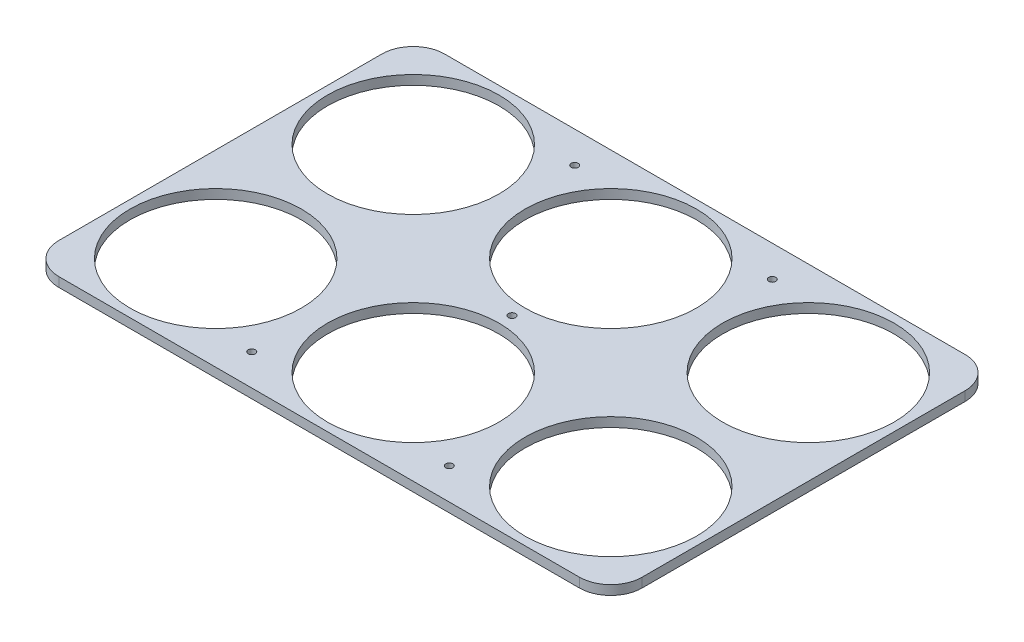
ISO-10303-21;
HEADER;
FILE_DESCRIPTION(('STEP AP214'),'2;1');
FILE_NAME('part.step','',(''),(''),'','','');
FILE_SCHEMA(('AUTOMOTIVE_DESIGN { 1 0 10303 214 1 1 1 1 }'));
ENDSEC;
DATA;
#1=APPLICATION_CONTEXT('core data for automotive mechanical design processes');
#2=APPLICATION_PROTOCOL_DEFINITION('international standard','automotive_design',2000,#1);
#3=PRODUCT_CONTEXT('',#1,'mechanical');
#4=PRODUCT('Part','Part','',(#3));
#5=PRODUCT_RELATED_PRODUCT_CATEGORY('part','',(#4));
#6=PRODUCT_DEFINITION_FORMATION('','',#4);
#7=PRODUCT_DEFINITION_CONTEXT('part definition',#1,'design');
#8=PRODUCT_DEFINITION('design','',#6,#7);
#9=PRODUCT_DEFINITION_SHAPE('','',#8);
#10=(LENGTH_UNIT() NAMED_UNIT(*) SI_UNIT(.MILLI.,.METRE.));
#11=(NAMED_UNIT(*) PLANE_ANGLE_UNIT() SI_UNIT($,.RADIAN.));
#12=(NAMED_UNIT(*) SI_UNIT($,.STERADIAN.) SOLID_ANGLE_UNIT());
#13=UNCERTAINTY_MEASURE_WITH_UNIT(LENGTH_MEASURE(1.E-05),#10,'distance_accuracy_value','');
#14=(GEOMETRIC_REPRESENTATION_CONTEXT(3) GLOBAL_UNCERTAINTY_ASSIGNED_CONTEXT((#13)) GLOBAL_UNIT_ASSIGNED_CONTEXT((#10,
#11,#12)) REPRESENTATION_CONTEXT('',''));
#15=CARTESIAN_POINT('',(0.,0.,0.));
#16=DIRECTION('',(0.,0.,1.));
#17=DIRECTION('',(1.,0.,0.));
#18=AXIS2_PLACEMENT_3D('',#15,#16,#17);
#19=CARTESIAN_POINT('',(0.,3.,0.));
#20=DIRECTION('',(0.,-1.,0.));
#21=DIRECTION('',(0.,0.,-1.));
#22=AXIS2_PLACEMENT_3D('',#19,#20,#21);
#23=PLANE('',#22);
#24=CARTESIAN_POINT('',(0.,3.,0.));
#25=DIRECTION('',(0.,1.,0.));
#26=DIRECTION('',(0.,0.,1.));
#27=AXIS2_PLACEMENT_3D('',#24,#25,#26);
#28=CIRCLE('',#27,1.13029999999999);
#29=CARTESIAN_POINT('',(0.,3.,1.13029999999999));
#30=VERTEX_POINT('',#29);
#31=EDGE_CURVE('E236',#30,#30,#28,.T.);
#32=ORIENTED_EDGE('',*,*,#31,.F.);
#33=EDGE_LOOP('',(#32));
#34=FACE_BOUND('',#33,.T.);
#35=CARTESIAN_POINT('',(31.5000000000051,3.,-51.5));
#36=DIRECTION('',(0.,1.,0.));
#37=DIRECTION('',(0.,0.,1.));
#38=AXIS2_PLACEMENT_3D('',#35,#36,#37);
#39=CIRCLE('',#38,1.13029999999999);
#40=CARTESIAN_POINT('',(31.5000000000051,3.,-50.3697));
#41=VERTEX_POINT('',#40);
#42=EDGE_CURVE('E230',#41,#41,#39,.T.);
#43=ORIENTED_EDGE('',*,*,#42,.F.);
#44=EDGE_LOOP('',(#43));
#45=FACE_BOUND('',#44,.T.);
#46=CARTESIAN_POINT('',(-31.5000000000052,3.,-51.5));
#47=DIRECTION('',(0.,1.,0.));
#48=DIRECTION('',(0.,0.,1.));
#49=AXIS2_PLACEMENT_3D('',#46,#47,#48);
#50=CIRCLE('',#49,1.13029999999999);
#51=CARTESIAN_POINT('',(-31.5000000000052,3.,-50.3697));
#52=VERTEX_POINT('',#51);
#53=EDGE_CURVE('E224',#52,#52,#50,.T.);
#54=ORIENTED_EDGE('',*,*,#53,.F.);
#55=EDGE_LOOP('',(#54));
#56=FACE_BOUND('',#55,.T.);
#57=CARTESIAN_POINT('',(-31.5000000000052,3.,51.5));
#58=DIRECTION('',(0.,1.,0.));
#59=DIRECTION('',(0.,0.,1.));
#60=AXIS2_PLACEMENT_3D('',#57,#58,#59);
#61=CIRCLE('',#60,1.13029999999999);
#62=CARTESIAN_POINT('',(-31.5000000000052,3.,52.6303));
#63=VERTEX_POINT('',#62);
#64=EDGE_CURVE('E218',#63,#63,#61,.T.);
#65=ORIENTED_EDGE('',*,*,#64,.F.);
#66=EDGE_LOOP('',(#65));
#67=FACE_BOUND('',#66,.T.);
#68=CARTESIAN_POINT('',(31.5000000000051,3.,51.5));
#69=DIRECTION('',(0.,1.,0.));
#70=DIRECTION('',(0.,0.,1.));
#71=AXIS2_PLACEMENT_3D('',#68,#69,#70);
#72=CIRCLE('',#71,1.13029999999999);
#73=CARTESIAN_POINT('',(31.5000000000051,3.,52.6303));
#74=VERTEX_POINT('',#73);
#75=EDGE_CURVE('E212',#74,#74,#72,.T.);
#76=ORIENTED_EDGE('',*,*,#75,.F.);
#77=EDGE_LOOP('',(#76));
#78=FACE_BOUND('',#77,.T.);
#79=DIRECTION('',(0.,0.,-1.));
#80=VECTOR('',#79,1.);
#81=CARTESIAN_POINT('',(93.0000000000051,3.,-61.5));
#82=LINE('',#81,#80);
#83=CARTESIAN_POINT('',(93.0000000000051,3.,51.5));
#84=VERTEX_POINT('',#83);
#85=CARTESIAN_POINT('',(93.0000000000051,3.,-51.5));
#86=VERTEX_POINT('',#85);
#87=EDGE_CURVE('E173',#84,#86,#82,.T.);
#88=ORIENTED_EDGE('',*,*,#87,.T.);
#89=CARTESIAN_POINT('',(83.0000000000051,3.,-51.5));
#90=DIRECTION('',(0.,-1.,0.));
#91=DIRECTION('',(0.,0.,-1.));
#92=AXIS2_PLACEMENT_3D('',#89,#90,#91);
#93=CIRCLE('',#92,10.);
#94=CARTESIAN_POINT('',(83.0000000000051,3.,-61.5));
#95=VERTEX_POINT('',#94);
#96=EDGE_CURVE('E150',#86,#95,#93,.F.);
#97=ORIENTED_EDGE('',*,*,#96,.T.);
#98=DIRECTION('',(-1.,0.,0.));
#99=VECTOR('',#98,1.);
#100=CARTESIAN_POINT('',(93.0000000000051,3.,-61.5));
#101=LINE('',#100,#99);
#102=CARTESIAN_POINT('',(-83.0000000000052,3.,-61.5));
#103=VERTEX_POINT('',#102);
#104=EDGE_CURVE('E121',#95,#103,#101,.T.);
#105=ORIENTED_EDGE('',*,*,#104,.T.);
#106=CARTESIAN_POINT('',(-83.0000000000052,3.,-51.5));
#107=DIRECTION('',(0.,-1.,0.));
#108=DIRECTION('',(0.,0.,-1.));
#109=AXIS2_PLACEMENT_3D('',#106,#107,#108);
#110=CIRCLE('',#109,10.);
#111=CARTESIAN_POINT('',(-93.0000000000052,3.,-51.5));
#112=VERTEX_POINT('',#111);
#113=EDGE_CURVE('E145',#103,#112,#110,.F.);
#114=ORIENTED_EDGE('',*,*,#113,.T.);
#115=DIRECTION('',(0.,0.,1.));
#116=VECTOR('',#115,1.);
#117=CARTESIAN_POINT('',(-93.0000000000052,3.,-61.5));
#118=LINE('',#117,#116);
#119=CARTESIAN_POINT('',(-93.0000000000051,3.,51.5));
#120=VERTEX_POINT('',#119);
#121=EDGE_CURVE('E128',#112,#120,#118,.T.);
#122=ORIENTED_EDGE('',*,*,#121,.T.);
#123=CARTESIAN_POINT('',(-83.0000000000052,3.,51.5));
#124=DIRECTION('',(0.,-1.,0.));
#125=DIRECTION('',(0.,0.,-1.));
#126=AXIS2_PLACEMENT_3D('',#123,#124,#125);
#127=CIRCLE('',#126,10.);
#128=CARTESIAN_POINT('',(-83.0000000000052,3.,61.5));
#129=VERTEX_POINT('',#128);
#130=EDGE_CURVE('E57',#120,#129,#127,.F.);
#131=ORIENTED_EDGE('',*,*,#130,.T.);
#132=DIRECTION('',(1.,0.,0.));
#133=VECTOR('',#132,1.);
#134=CARTESIAN_POINT('',(93.0000000000051,3.,61.5));
#135=LINE('',#134,#133);
#136=CARTESIAN_POINT('',(83.0000000000051,3.,61.5));
#137=VERTEX_POINT('',#136);
#138=EDGE_CURVE('E131',#129,#137,#135,.T.);
#139=ORIENTED_EDGE('',*,*,#138,.T.);
#140=CARTESIAN_POINT('',(83.0000000000051,3.,51.5));
#141=DIRECTION('',(0.,-1.,0.));
#142=DIRECTION('',(0.,0.,-1.));
#143=AXIS2_PLACEMENT_3D('',#140,#141,#142);
#144=CIRCLE('',#143,10.);
#145=EDGE_CURVE('E148',#137,#84,#144,.F.);
#146=ORIENTED_EDGE('',*,*,#145,.T.);
#147=EDGE_LOOP('',(#88,#97,#105,#114,#122,#131,#139,#146));
#148=FACE_BOUND('',#147,.T.);
#149=CARTESIAN_POINT('',(-63.0000000000052,3.,-31.5));
#150=DIRECTION('',(0.,1.,0.));
#151=DIRECTION('',(0.,0.,1.));
#152=AXIS2_PLACEMENT_3D('',#149,#150,#151);
#153=CIRCLE('',#152,27.3500000000029);
#154=CARTESIAN_POINT('',(-63.0000000000052,3.,-4.14999999999714));
#155=VERTEX_POINT('',#154);
#156=EDGE_CURVE('E166',#155,#155,#153,.T.);
#157=ORIENTED_EDGE('',*,*,#156,.F.);
#158=EDGE_LOOP('',(#157));
#159=FACE_BOUND('',#158,.T.);
#160=CARTESIAN_POINT('',(-6.06459327201492E-12,3.,-31.5000000000009));
#161=DIRECTION('',(0.,1.,0.));
#162=DIRECTION('',(0.,0.,1.));
#163=AXIS2_PLACEMENT_3D('',#160,#161,#162);
#164=CIRCLE('',#163,27.3500000000029);
#165=CARTESIAN_POINT('',(-6.06459327201492E-12,3.,-4.14999999999801));
#166=VERTEX_POINT('',#165);
#167=EDGE_CURVE('E178',#166,#166,#164,.T.);
#168=ORIENTED_EDGE('',*,*,#167,.F.);
#169=EDGE_LOOP('',(#168));
#170=FACE_BOUND('',#169,.T.);
#171=CARTESIAN_POINT('',(62.999999999993,3.,-31.5000000000017));
#172=DIRECTION('',(0.,1.,0.));
#173=DIRECTION('',(0.,0.,1.));
#174=AXIS2_PLACEMENT_3D('',#171,#172,#173);
#175=CIRCLE('',#174,27.3500000000029);
#176=CARTESIAN_POINT('',(62.999999999993,3.,-4.1499999999989));
#177=VERTEX_POINT('',#176);
#178=EDGE_CURVE('E183',#177,#177,#175,.T.);
#179=ORIENTED_EDGE('',*,*,#178,.F.);
#180=EDGE_LOOP('',(#179));
#181=FACE_BOUND('',#180,.T.);
#182=CARTESIAN_POINT('',(0.,3.,31.4999999999991));
#183=DIRECTION('',(0.,1.,0.));
#184=DIRECTION('',(0.,0.,1.));
#185=AXIS2_PLACEMENT_3D('',#182,#183,#184);
#186=CIRCLE('',#185,27.3500000000029);
#187=CARTESIAN_POINT('',(0.,3.,58.850000000002));
#188=VERTEX_POINT('',#187);
#189=EDGE_CURVE('E189',#188,#188,#186,.T.);
#190=ORIENTED_EDGE('',*,*,#189,.F.);
#191=EDGE_LOOP('',(#190));
#192=FACE_BOUND('',#191,.T.);
#193=CARTESIAN_POINT('',(62.9999999999991,3.,31.4999999999983));
#194=DIRECTION('',(0.,1.,0.));
#195=DIRECTION('',(0.,0.,1.));
#196=AXIS2_PLACEMENT_3D('',#193,#194,#195);
#197=CIRCLE('',#196,27.3500000000029);
#198=CARTESIAN_POINT('',(62.9999999999991,3.,58.8500000000011));
#199=VERTEX_POINT('',#198);
#200=EDGE_CURVE('E195',#199,#199,#197,.T.);
#201=ORIENTED_EDGE('',*,*,#200,.F.);
#202=EDGE_LOOP('',(#201));
#203=FACE_BOUND('',#202,.T.);
#204=CARTESIAN_POINT('',(-62.9999999999991,3.,31.5));
#205=DIRECTION('',(0.,1.,0.));
#206=DIRECTION('',(0.,0.,1.));
#207=AXIS2_PLACEMENT_3D('',#204,#205,#206);
#208=CIRCLE('',#207,27.3500000000029);
#209=CARTESIAN_POINT('',(-62.9999999999991,3.,58.8500000000029));
#210=VERTEX_POINT('',#209);
#211=EDGE_CURVE('E201',#210,#210,#208,.T.);
#212=ORIENTED_EDGE('',*,*,#211,.F.);
#213=EDGE_LOOP('',(#212));
#214=FACE_BOUND('',#213,.T.);
#215=ADVANCED_FACE('F35',(#34,#45,#56,#67,#78,#148,#159,#170,#181,#192,#203,#214),#23,.F.);
#216=CARTESIAN_POINT('',(0.,0.,0.));
#217=DIRECTION('',(0.,-1.,0.));
#218=DIRECTION('',(0.,0.,-1.));
#219=AXIS2_PLACEMENT_3D('',#216,#217,#218);
#220=PLANE('',#219);
#221=CARTESIAN_POINT('',(0.,0.,0.));
#222=DIRECTION('',(0.,1.,0.));
#223=DIRECTION('',(0.,0.,1.));
#224=AXIS2_PLACEMENT_3D('',#221,#222,#223);
#225=CIRCLE('',#224,1.1303);
#226=CARTESIAN_POINT('',(0.,0.,1.1303));
#227=VERTEX_POINT('',#226);
#228=EDGE_CURVE('E233',#227,#227,#225,.T.);
#229=ORIENTED_EDGE('',*,*,#228,.T.);
#230=EDGE_LOOP('',(#229));
#231=FACE_BOUND('',#230,.T.);
#232=CARTESIAN_POINT('',(31.5000000000051,0.,-51.5));
#233=DIRECTION('',(0.,1.,0.));
#234=DIRECTION('',(0.,0.,1.));
#235=AXIS2_PLACEMENT_3D('',#232,#233,#234);
#236=CIRCLE('',#235,1.1303);
#237=CARTESIAN_POINT('',(31.5000000000051,0.,-50.3697));
#238=VERTEX_POINT('',#237);
#239=EDGE_CURVE('E227',#238,#238,#236,.T.);
#240=ORIENTED_EDGE('',*,*,#239,.T.);
#241=EDGE_LOOP('',(#240));
#242=FACE_BOUND('',#241,.T.);
#243=CARTESIAN_POINT('',(-31.5000000000052,0.,-51.5));
#244=DIRECTION('',(0.,1.,0.));
#245=DIRECTION('',(0.,0.,1.));
#246=AXIS2_PLACEMENT_3D('',#243,#244,#245);
#247=CIRCLE('',#246,1.1303);
#248=CARTESIAN_POINT('',(-31.5000000000052,0.,-50.3697));
#249=VERTEX_POINT('',#248);
#250=EDGE_CURVE('E221',#249,#249,#247,.T.);
#251=ORIENTED_EDGE('',*,*,#250,.T.);
#252=EDGE_LOOP('',(#251));
#253=FACE_BOUND('',#252,.T.);
#254=CARTESIAN_POINT('',(-31.5000000000052,0.,51.5));
#255=DIRECTION('',(0.,1.,0.));
#256=DIRECTION('',(0.,0.,1.));
#257=AXIS2_PLACEMENT_3D('',#254,#255,#256);
#258=CIRCLE('',#257,1.1303);
#259=CARTESIAN_POINT('',(-31.5000000000052,0.,52.6303));
#260=VERTEX_POINT('',#259);
#261=EDGE_CURVE('E215',#260,#260,#258,.T.);
#262=ORIENTED_EDGE('',*,*,#261,.T.);
#263=EDGE_LOOP('',(#262));
#264=FACE_BOUND('',#263,.T.);
#265=CARTESIAN_POINT('',(31.5000000000051,0.,51.5));
#266=DIRECTION('',(0.,1.,0.));
#267=DIRECTION('',(0.,0.,1.));
#268=AXIS2_PLACEMENT_3D('',#265,#266,#267);
#269=CIRCLE('',#268,1.1303);
#270=CARTESIAN_POINT('',(31.5000000000051,0.,52.6303));
#271=VERTEX_POINT('',#270);
#272=EDGE_CURVE('E207',#271,#271,#269,.T.);
#273=ORIENTED_EDGE('',*,*,#272,.T.);
#274=EDGE_LOOP('',(#273));
#275=FACE_BOUND('',#274,.T.);
#276=CARTESIAN_POINT('',(62.9999999999991,0.,31.4999999999983));
#277=DIRECTION('',(0.,1.,0.));
#278=DIRECTION('',(0.,0.,1.));
#279=AXIS2_PLACEMENT_3D('',#276,#277,#278);
#280=CIRCLE('',#279,27.3500000000029);
#281=CARTESIAN_POINT('',(62.9999999999991,0.,58.8500000000011));
#282=VERTEX_POINT('',#281);
#283=EDGE_CURVE('E198',#282,#282,#280,.T.);
#284=ORIENTED_EDGE('',*,*,#283,.T.);
#285=EDGE_LOOP('',(#284));
#286=FACE_BOUND('',#285,.T.);
#287=CARTESIAN_POINT('',(62.999999999993,0.,-31.5000000000017));
#288=DIRECTION('',(0.,1.,0.));
#289=DIRECTION('',(0.,0.,1.));
#290=AXIS2_PLACEMENT_3D('',#287,#288,#289);
#291=CIRCLE('',#290,27.3500000000029);
#292=CARTESIAN_POINT('',(62.999999999993,0.,-4.1499999999989));
#293=VERTEX_POINT('',#292);
#294=EDGE_CURVE('E186',#293,#293,#291,.T.);
#295=ORIENTED_EDGE('',*,*,#294,.T.);
#296=EDGE_LOOP('',(#295));
#297=FACE_BOUND('',#296,.T.);
#298=CARTESIAN_POINT('',(-63.0000000000052,0.,-31.5));
#299=DIRECTION('',(0.,1.,0.));
#300=DIRECTION('',(0.,0.,1.));
#301=AXIS2_PLACEMENT_3D('',#298,#299,#300);
#302=CIRCLE('',#301,27.3500000000029);
#303=CARTESIAN_POINT('',(-63.0000000000052,0.,-4.14999999999714));
#304=VERTEX_POINT('',#303);
#305=EDGE_CURVE('E169',#304,#304,#302,.T.);
#306=ORIENTED_EDGE('',*,*,#305,.T.);
#307=EDGE_LOOP('',(#306));
#308=FACE_BOUND('',#307,.T.);
#309=DIRECTION('',(-1.,0.,0.));
#310=VECTOR('',#309,1.);
#311=CARTESIAN_POINT('',(93.0000000000051,0.,-61.5));
#312=LINE('',#311,#310);
#313=CARTESIAN_POINT('',(83.0000000000051,0.,-61.5));
#314=VERTEX_POINT('',#313);
#315=CARTESIAN_POINT('',(-83.0000000000052,0.,-61.5));
#316=VERTEX_POINT('',#315);
#317=EDGE_CURVE('E118',#314,#316,#312,.T.);
#318=ORIENTED_EDGE('',*,*,#317,.F.);
#319=CARTESIAN_POINT('',(83.0000000000051,0.,-51.5));
#320=DIRECTION('',(0.,-1.,0.));
#321=DIRECTION('',(0.,0.,-1.));
#322=AXIS2_PLACEMENT_3D('',#319,#320,#321);
#323=CIRCLE('',#322,10.);
#324=CARTESIAN_POINT('',(93.0000000000051,0.,-51.5));
#325=VERTEX_POINT('',#324);
#326=EDGE_CURVE('E101',#314,#325,#323,.T.);
#327=ORIENTED_EDGE('',*,*,#326,.T.);
#328=DIRECTION('',(0.,0.,-1.));
#329=VECTOR('',#328,1.);
#330=CARTESIAN_POINT('',(93.0000000000051,0.,-61.5));
#331=LINE('',#330,#329);
#332=CARTESIAN_POINT('',(93.0000000000051,0.,51.5));
#333=VERTEX_POINT('',#332);
#334=EDGE_CURVE('E129',#333,#325,#331,.T.);
#335=ORIENTED_EDGE('',*,*,#334,.F.);
#336=CARTESIAN_POINT('',(83.0000000000051,0.,51.5));
#337=DIRECTION('',(0.,-1.,0.));
#338=DIRECTION('',(0.,0.,-1.));
#339=AXIS2_PLACEMENT_3D('',#336,#337,#338);
#340=CIRCLE('',#339,10.);
#341=CARTESIAN_POINT('',(83.0000000000051,0.,61.5));
#342=VERTEX_POINT('',#341);
#343=EDGE_CURVE('E112',#333,#342,#340,.T.);
#344=ORIENTED_EDGE('',*,*,#343,.T.);
#345=DIRECTION('',(1.,0.,0.));
#346=VECTOR('',#345,1.);
#347=CARTESIAN_POINT('',(93.0000000000051,0.,61.5));
#348=LINE('',#347,#346);
#349=CARTESIAN_POINT('',(-83.0000000000052,0.,61.5));
#350=VERTEX_POINT('',#349);
#351=EDGE_CURVE('E133',#350,#342,#348,.T.);
#352=ORIENTED_EDGE('',*,*,#351,.F.);
#353=CARTESIAN_POINT('',(-83.0000000000052,0.,51.5));
#354=DIRECTION('',(0.,-1.,0.));
#355=DIRECTION('',(0.,0.,-1.));
#356=AXIS2_PLACEMENT_3D('',#353,#354,#355);
#357=CIRCLE('',#356,10.);
#358=CARTESIAN_POINT('',(-93.0000000000051,0.,51.5));
#359=VERTEX_POINT('',#358);
#360=EDGE_CURVE('E139',#350,#359,#357,.T.);
#361=ORIENTED_EDGE('',*,*,#360,.T.);
#362=DIRECTION('',(0.,0.,1.));
#363=VECTOR('',#362,1.);
#364=CARTESIAN_POINT('',(-93.0000000000052,0.,-61.5));
#365=LINE('',#364,#363);
#366=CARTESIAN_POINT('',(-93.0000000000052,0.,-51.5));
#367=VERTEX_POINT('',#366);
#368=EDGE_CURVE('E161',#367,#359,#365,.T.);
#369=ORIENTED_EDGE('',*,*,#368,.F.);
#370=CARTESIAN_POINT('',(-83.0000000000052,0.,-51.5));
#371=DIRECTION('',(0.,-1.,0.));
#372=DIRECTION('',(0.,0.,-1.));
#373=AXIS2_PLACEMENT_3D('',#370,#371,#372);
#374=CIRCLE('',#373,10.);
#375=EDGE_CURVE('E122',#367,#316,#374,.T.);
#376=ORIENTED_EDGE('',*,*,#375,.T.);
#377=EDGE_LOOP('',(#318,#327,#335,#344,#352,#361,#369,#376));
#378=FACE_BOUND('',#377,.T.);
#379=CARTESIAN_POINT('',(-6.06459327201492E-12,0.,-31.5000000000009));
#380=DIRECTION('',(0.,1.,0.));
#381=DIRECTION('',(0.,0.,1.));
#382=AXIS2_PLACEMENT_3D('',#379,#380,#381);
#383=CIRCLE('',#382,27.3500000000029);
#384=CARTESIAN_POINT('',(-6.06459327201492E-12,0.,-4.14999999999801));
#385=VERTEX_POINT('',#384);
#386=EDGE_CURVE('E180',#385,#385,#383,.T.);
#387=ORIENTED_EDGE('',*,*,#386,.T.);
#388=EDGE_LOOP('',(#387));
#389=FACE_BOUND('',#388,.T.);
#390=CARTESIAN_POINT('',(0.,0.,31.4999999999991));
#391=DIRECTION('',(0.,1.,0.));
#392=DIRECTION('',(0.,0.,1.));
#393=AXIS2_PLACEMENT_3D('',#390,#391,#392);
#394=CIRCLE('',#393,27.3500000000029);
#395=CARTESIAN_POINT('',(0.,0.,58.850000000002));
#396=VERTEX_POINT('',#395);
#397=EDGE_CURVE('E192',#396,#396,#394,.T.);
#398=ORIENTED_EDGE('',*,*,#397,.T.);
#399=EDGE_LOOP('',(#398));
#400=FACE_BOUND('',#399,.T.);
#401=CARTESIAN_POINT('',(-62.9999999999991,0.,31.5));
#402=DIRECTION('',(0.,1.,0.));
#403=DIRECTION('',(0.,0.,1.));
#404=AXIS2_PLACEMENT_3D('',#401,#402,#403);
#405=CIRCLE('',#404,27.3500000000029);
#406=CARTESIAN_POINT('',(-62.9999999999991,0.,58.8500000000029));
#407=VERTEX_POINT('',#406);
#408=EDGE_CURVE('E204',#407,#407,#405,.T.);
#409=ORIENTED_EDGE('',*,*,#408,.T.);
#410=EDGE_LOOP('',(#409));
#411=FACE_BOUND('',#410,.T.);
#412=ADVANCED_FACE('F125',(#231,#242,#253,#264,#275,#286,#297,#308,#378,#389,#400,#411),#220,.T.);
#413=CARTESIAN_POINT('',(-93.0000000000052,3.,-61.5));
#414=DIRECTION('',(1.,0.,0.));
#415=DIRECTION('',(0.,0.,-1.));
#416=AXIS2_PLACEMENT_3D('',#413,#414,#415);
#417=PLANE('',#416);
#418=ORIENTED_EDGE('',*,*,#368,.T.);
#419=DIRECTION('',(0.,-1.,0.));
#420=VECTOR('',#419,1.);
#421=CARTESIAN_POINT('',(-93.0000000000051,3.,51.5));
#422=LINE('',#421,#420);
#423=EDGE_CURVE('E11',#359,#120,#422,.F.);
#424=ORIENTED_EDGE('',*,*,#423,.T.);
#425=ORIENTED_EDGE('',*,*,#121,.F.);
#426=DIRECTION('',(0.,-1.,0.));
#427=VECTOR('',#426,1.);
#428=CARTESIAN_POINT('',(-93.0000000000052,3.,-51.5));
#429=LINE('',#428,#427);
#430=EDGE_CURVE('E43',#112,#367,#429,.T.);
#431=ORIENTED_EDGE('',*,*,#430,.T.);
#432=EDGE_LOOP('',(#418,#424,#425,#431));
#433=FACE_BOUND('',#432,.T.);
#434=ADVANCED_FACE('F160',(#433),#417,.F.);
#435=CARTESIAN_POINT('',(93.0000000000051,3.,61.5));
#436=DIRECTION('',(0.,0.,-1.));
#437=DIRECTION('',(-1.,0.,0.));
#438=AXIS2_PLACEMENT_3D('',#435,#436,#437);
#439=PLANE('',#438);
#440=ORIENTED_EDGE('',*,*,#351,.T.);
#441=DIRECTION('',(0.,-1.,0.));
#442=VECTOR('',#441,1.);
#443=CARTESIAN_POINT('',(83.0000000000051,3.,61.5));
#444=LINE('',#443,#442);
#445=EDGE_CURVE('E50',#342,#137,#444,.F.);
#446=ORIENTED_EDGE('',*,*,#445,.T.);
#447=ORIENTED_EDGE('',*,*,#138,.F.);
#448=DIRECTION('',(0.,-1.,0.));
#449=VECTOR('',#448,1.);
#450=CARTESIAN_POINT('',(-83.0000000000052,3.,61.5));
#451=LINE('',#450,#449);
#452=EDGE_CURVE('E152',#129,#350,#451,.T.);
#453=ORIENTED_EDGE('',*,*,#452,.T.);
#454=EDGE_LOOP('',(#440,#446,#447,#453));
#455=FACE_BOUND('',#454,.T.);
#456=ADVANCED_FACE('F279',(#455),#439,.F.);
#457=CARTESIAN_POINT('',(93.0000000000051,3.,-61.5));
#458=DIRECTION('',(-1.,0.,0.));
#459=DIRECTION('',(0.,0.,1.));
#460=AXIS2_PLACEMENT_3D('',#457,#458,#459);
#461=PLANE('',#460);
#462=ORIENTED_EDGE('',*,*,#334,.T.);
#463=DIRECTION('',(0.,-1.,0.));
#464=VECTOR('',#463,1.);
#465=CARTESIAN_POINT('',(93.0000000000051,3.,-51.5));
#466=LINE('',#465,#464);
#467=EDGE_CURVE('E106',#325,#86,#466,.F.);
#468=ORIENTED_EDGE('',*,*,#467,.T.);
#469=ORIENTED_EDGE('',*,*,#87,.F.);
#470=DIRECTION('',(0.,-1.,0.));
#471=VECTOR('',#470,1.);
#472=CARTESIAN_POINT('',(93.0000000000051,3.,51.5));
#473=LINE('',#472,#471);
#474=EDGE_CURVE('E111',#84,#333,#473,.T.);
#475=ORIENTED_EDGE('',*,*,#474,.T.);
#476=EDGE_LOOP('',(#462,#468,#469,#475));
#477=FACE_BOUND('',#476,.T.);
#478=ADVANCED_FACE('F287',(#477),#461,.F.);
#479=CARTESIAN_POINT('',(93.0000000000051,3.,-61.5));
#480=DIRECTION('',(0.,0.,1.));
#481=DIRECTION('',(1.,0.,0.));
#482=AXIS2_PLACEMENT_3D('',#479,#480,#481);
#483=PLANE('',#482);
#484=ORIENTED_EDGE('',*,*,#104,.F.);
#485=DIRECTION('',(0.,-1.,0.));
#486=VECTOR('',#485,1.);
#487=CARTESIAN_POINT('',(83.0000000000051,3.,-61.5));
#488=LINE('',#487,#486);
#489=EDGE_CURVE('E105',#95,#314,#488,.T.);
#490=ORIENTED_EDGE('',*,*,#489,.T.);
#491=ORIENTED_EDGE('',*,*,#317,.T.);
#492=DIRECTION('',(0.,-1.,0.));
#493=VECTOR('',#492,1.);
#494=CARTESIAN_POINT('',(-83.0000000000052,3.,-61.5));
#495=LINE('',#494,#493);
#496=EDGE_CURVE('E123',#316,#103,#495,.F.);
#497=ORIENTED_EDGE('',*,*,#496,.T.);
#498=EDGE_LOOP('',(#484,#490,#491,#497));
#499=FACE_BOUND('',#498,.T.);
#500=ADVANCED_FACE('F117',(#499),#483,.F.);
#501=CARTESIAN_POINT('',(-63.0000000000052,3.,-31.5));
#502=DIRECTION('',(0.,-1.,0.));
#503=DIRECTION('',(0.,0.,-1.));
#504=AXIS2_PLACEMENT_3D('',#501,#502,#503);
#505=CYLINDRICAL_SURFACE('',#504,27.3500000000029);
#506=ORIENTED_EDGE('',*,*,#156,.T.);
#507=EDGE_LOOP('',(#506));
#508=FACE_BOUND('',#507,.T.);
#509=ORIENTED_EDGE('',*,*,#305,.F.);
#510=EDGE_LOOP('',(#509));
#511=FACE_BOUND('',#510,.T.);
#512=ADVANCED_FACE('F286',(#508,#511),#505,.F.);
#513=CARTESIAN_POINT('',(-6.06459327201492E-12,3.,-31.5000000000009));
#514=DIRECTION('',(0.,-1.,0.));
#515=DIRECTION('',(0.,0.,-1.));
#516=AXIS2_PLACEMENT_3D('',#513,#514,#515);
#517=CYLINDRICAL_SURFACE('',#516,27.3500000000029);
#518=ORIENTED_EDGE('',*,*,#167,.T.);
#519=EDGE_LOOP('',(#518));
#520=FACE_BOUND('',#519,.T.);
#521=ORIENTED_EDGE('',*,*,#386,.F.);
#522=EDGE_LOOP('',(#521));
#523=FACE_BOUND('',#522,.T.);
#524=ADVANCED_FACE('F334',(#520,#523),#517,.F.);
#525=CARTESIAN_POINT('',(62.999999999993,3.,-31.5000000000017));
#526=DIRECTION('',(0.,-1.,0.));
#527=DIRECTION('',(0.,0.,-1.));
#528=AXIS2_PLACEMENT_3D('',#525,#526,#527);
#529=CYLINDRICAL_SURFACE('',#528,27.3500000000029);
#530=ORIENTED_EDGE('',*,*,#178,.T.);
#531=EDGE_LOOP('',(#530));
#532=FACE_BOUND('',#531,.T.);
#533=ORIENTED_EDGE('',*,*,#294,.F.);
#534=EDGE_LOOP('',(#533));
#535=FACE_BOUND('',#534,.T.);
#536=ADVANCED_FACE('F330',(#532,#535),#529,.F.);
#537=CARTESIAN_POINT('',(0.,3.,31.4999999999991));
#538=DIRECTION('',(0.,-1.,0.));
#539=DIRECTION('',(0.,0.,-1.));
#540=AXIS2_PLACEMENT_3D('',#537,#538,#539);
#541=CYLINDRICAL_SURFACE('',#540,27.3500000000029);
#542=ORIENTED_EDGE('',*,*,#189,.T.);
#543=EDGE_LOOP('',(#542));
#544=FACE_BOUND('',#543,.T.);
#545=ORIENTED_EDGE('',*,*,#397,.F.);
#546=EDGE_LOOP('',(#545));
#547=FACE_BOUND('',#546,.T.);
#548=ADVANCED_FACE('F326',(#544,#547),#541,.F.);
#549=CARTESIAN_POINT('',(62.9999999999991,3.,31.4999999999983));
#550=DIRECTION('',(0.,-1.,0.));
#551=DIRECTION('',(0.,0.,-1.));
#552=AXIS2_PLACEMENT_3D('',#549,#550,#551);
#553=CYLINDRICAL_SURFACE('',#552,27.3500000000029);
#554=ORIENTED_EDGE('',*,*,#200,.T.);
#555=EDGE_LOOP('',(#554));
#556=FACE_BOUND('',#555,.T.);
#557=ORIENTED_EDGE('',*,*,#283,.F.);
#558=EDGE_LOOP('',(#557));
#559=FACE_BOUND('',#558,.T.);
#560=ADVANCED_FACE('F269',(#556,#559),#553,.F.);
#561=CARTESIAN_POINT('',(-62.9999999999991,3.,31.5));
#562=DIRECTION('',(0.,-1.,0.));
#563=DIRECTION('',(0.,0.,-1.));
#564=AXIS2_PLACEMENT_3D('',#561,#562,#563);
#565=CYLINDRICAL_SURFACE('',#564,27.3500000000029);
#566=ORIENTED_EDGE('',*,*,#211,.T.);
#567=EDGE_LOOP('',(#566));
#568=FACE_BOUND('',#567,.T.);
#569=ORIENTED_EDGE('',*,*,#408,.F.);
#570=EDGE_LOOP('',(#569));
#571=FACE_BOUND('',#570,.T.);
#572=ADVANCED_FACE('F266',(#568,#571),#565,.F.);
#573=CARTESIAN_POINT('',(83.0000000000051,3.,-51.5));
#574=DIRECTION('',(0.,-1.,0.));
#575=DIRECTION('',(0.,0.,-1.));
#576=AXIS2_PLACEMENT_3D('',#573,#574,#575);
#577=CYLINDRICAL_SURFACE('',#576,10.);
#578=ORIENTED_EDGE('',*,*,#96,.F.);
#579=ORIENTED_EDGE('',*,*,#467,.F.);
#580=ORIENTED_EDGE('',*,*,#326,.F.);
#581=ORIENTED_EDGE('',*,*,#489,.F.);
#582=EDGE_LOOP('',(#578,#579,#580,#581));
#583=FACE_BOUND('',#582,.T.);
#584=ADVANCED_FACE('F104',(#583),#577,.T.);
#585=CARTESIAN_POINT('',(83.0000000000051,3.,51.5));
#586=DIRECTION('',(0.,-1.,0.));
#587=DIRECTION('',(0.,0.,-1.));
#588=AXIS2_PLACEMENT_3D('',#585,#586,#587);
#589=CYLINDRICAL_SURFACE('',#588,10.);
#590=ORIENTED_EDGE('',*,*,#145,.F.);
#591=ORIENTED_EDGE('',*,*,#445,.F.);
#592=ORIENTED_EDGE('',*,*,#343,.F.);
#593=ORIENTED_EDGE('',*,*,#474,.F.);
#594=EDGE_LOOP('',(#590,#591,#592,#593));
#595=FACE_BOUND('',#594,.T.);
#596=ADVANCED_FACE('F295',(#595),#589,.T.);
#597=CARTESIAN_POINT('',(-83.0000000000052,3.,51.5));
#598=DIRECTION('',(0.,-1.,0.));
#599=DIRECTION('',(0.,0.,-1.));
#600=AXIS2_PLACEMENT_3D('',#597,#598,#599);
#601=CYLINDRICAL_SURFACE('',#600,10.);
#602=ORIENTED_EDGE('',*,*,#130,.F.);
#603=ORIENTED_EDGE('',*,*,#423,.F.);
#604=ORIENTED_EDGE('',*,*,#360,.F.);
#605=ORIENTED_EDGE('',*,*,#452,.F.);
#606=EDGE_LOOP('',(#602,#603,#604,#605));
#607=FACE_BOUND('',#606,.T.);
#608=ADVANCED_FACE('F297',(#607),#601,.T.);
#609=CARTESIAN_POINT('',(-83.0000000000052,3.,-51.5));
#610=DIRECTION('',(0.,-1.,0.));
#611=DIRECTION('',(0.,0.,-1.));
#612=AXIS2_PLACEMENT_3D('',#609,#610,#611);
#613=CYLINDRICAL_SURFACE('',#612,10.);
#614=ORIENTED_EDGE('',*,*,#113,.F.);
#615=ORIENTED_EDGE('',*,*,#496,.F.);
#616=ORIENTED_EDGE('',*,*,#375,.F.);
#617=ORIENTED_EDGE('',*,*,#430,.F.);
#618=EDGE_LOOP('',(#614,#615,#616,#617));
#619=FACE_BOUND('',#618,.T.);
#620=ADVANCED_FACE('F37',(#619),#613,.T.);
#621=CARTESIAN_POINT('',(31.5000000000051,3.,51.5));
#622=DIRECTION('',(0.,1.,0.));
#623=DIRECTION('',(0.,0.,1.));
#624=AXIS2_PLACEMENT_3D('',#621,#622,#623);
#625=CYLINDRICAL_SURFACE('',#624,1.13029999999999);
#626=ORIENTED_EDGE('',*,*,#272,.F.);
#627=EDGE_LOOP('',(#626));
#628=FACE_BOUND('',#627,.T.);
#629=ORIENTED_EDGE('',*,*,#75,.T.);
#630=EDGE_LOOP('',(#629));
#631=FACE_BOUND('',#630,.T.);
#632=ADVANCED_FACE('F304',(#628,#631),#625,.F.);
#633=CARTESIAN_POINT('',(-31.5000000000052,3.,51.5));
#634=DIRECTION('',(0.,1.,0.));
#635=DIRECTION('',(0.,0.,1.));
#636=AXIS2_PLACEMENT_3D('',#633,#634,#635);
#637=CYLINDRICAL_SURFACE('',#636,1.13029999999999);
#638=ORIENTED_EDGE('',*,*,#261,.F.);
#639=EDGE_LOOP('',(#638));
#640=FACE_BOUND('',#639,.T.);
#641=ORIENTED_EDGE('',*,*,#64,.T.);
#642=EDGE_LOOP('',(#641));
#643=FACE_BOUND('',#642,.T.);
#644=ADVANCED_FACE('F311',(#640,#643),#637,.F.);
#645=CARTESIAN_POINT('',(-31.5000000000052,3.,-51.5));
#646=DIRECTION('',(0.,1.,0.));
#647=DIRECTION('',(0.,0.,1.));
#648=AXIS2_PLACEMENT_3D('',#645,#646,#647);
#649=CYLINDRICAL_SURFACE('',#648,1.13029999999999);
#650=ORIENTED_EDGE('',*,*,#250,.F.);
#651=EDGE_LOOP('',(#650));
#652=FACE_BOUND('',#651,.T.);
#653=ORIENTED_EDGE('',*,*,#53,.T.);
#654=EDGE_LOOP('',(#653));
#655=FACE_BOUND('',#654,.T.);
#656=ADVANCED_FACE('F317',(#652,#655),#649,.F.);
#657=CARTESIAN_POINT('',(31.5000000000051,3.,-51.5));
#658=DIRECTION('',(0.,1.,0.));
#659=DIRECTION('',(0.,0.,1.));
#660=AXIS2_PLACEMENT_3D('',#657,#658,#659);
#661=CYLINDRICAL_SURFACE('',#660,1.13029999999999);
#662=ORIENTED_EDGE('',*,*,#239,.F.);
#663=EDGE_LOOP('',(#662));
#664=FACE_BOUND('',#663,.T.);
#665=ORIENTED_EDGE('',*,*,#42,.T.);
#666=EDGE_LOOP('',(#665));
#667=FACE_BOUND('',#666,.T.);
#668=ADVANCED_FACE('F414',(#664,#667),#661,.F.);
#669=CARTESIAN_POINT('',(0.,3.,0.));
#670=DIRECTION('',(0.,1.,0.));
#671=DIRECTION('',(0.,0.,1.));
#672=AXIS2_PLACEMENT_3D('',#669,#670,#671);
#673=CYLINDRICAL_SURFACE('',#672,1.13029999999999);
#674=ORIENTED_EDGE('',*,*,#228,.F.);
#675=EDGE_LOOP('',(#674));
#676=FACE_BOUND('',#675,.T.);
#677=ORIENTED_EDGE('',*,*,#31,.T.);
#678=EDGE_LOOP('',(#677));
#679=FACE_BOUND('',#678,.T.);
#680=ADVANCED_FACE('F240',(#676,#679),#673,.F.);
#681=CLOSED_SHELL('',(#215,#412,#434,#456,#478,#500,#512,#524,#536,#548,#560,#572,#584,#596,
#608,#620,#632,#644,#656,#668,#680));
#682=MANIFOLD_SOLID_BREP('B2',#681);
#683=ADVANCED_BREP_SHAPE_REPRESENTATION('',(#18,#682),#14);
#684=SHAPE_DEFINITION_REPRESENTATION(#9,#683);
ENDSEC;
END-ISO-10303-21;
